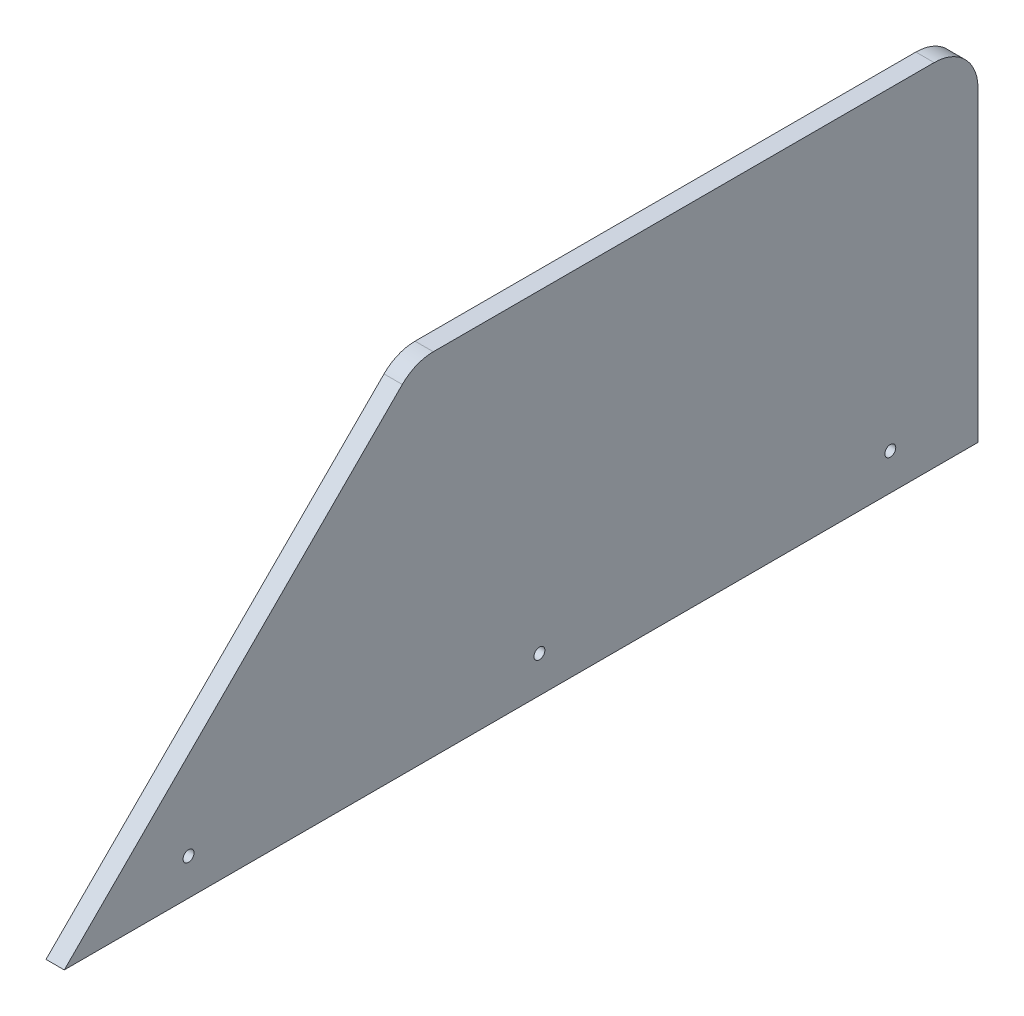
ISO-10303-21;
HEADER;
FILE_DESCRIPTION(('STEP AP214'),'2;1');
FILE_NAME('part.step','',(''),(''),'','','');
FILE_SCHEMA(('AUTOMOTIVE_DESIGN { 1 0 10303 214 1 1 1 1 }'));
ENDSEC;
DATA;
#1=APPLICATION_CONTEXT('core data for automotive mechanical design processes');
#2=APPLICATION_PROTOCOL_DEFINITION('international standard','automotive_design',2000,#1);
#3=PRODUCT_CONTEXT('',#1,'mechanical');
#4=PRODUCT('Part','Part','',(#3));
#5=PRODUCT_RELATED_PRODUCT_CATEGORY('part','',(#4));
#6=PRODUCT_DEFINITION_FORMATION('','',#4);
#7=PRODUCT_DEFINITION_CONTEXT('part definition',#1,'design');
#8=PRODUCT_DEFINITION('design','',#6,#7);
#9=PRODUCT_DEFINITION_SHAPE('','',#8);
#10=(LENGTH_UNIT() NAMED_UNIT(*) SI_UNIT(.MILLI.,.METRE.));
#11=(NAMED_UNIT(*) PLANE_ANGLE_UNIT() SI_UNIT($,.RADIAN.));
#12=(NAMED_UNIT(*) SI_UNIT($,.STERADIAN.) SOLID_ANGLE_UNIT());
#13=UNCERTAINTY_MEASURE_WITH_UNIT(LENGTH_MEASURE(1.E-05),#10,'distance_accuracy_value','');
#14=(GEOMETRIC_REPRESENTATION_CONTEXT(3) GLOBAL_UNCERTAINTY_ASSIGNED_CONTEXT((#13)) GLOBAL_UNIT_ASSIGNED_CONTEXT((#10,
#11,#12)) REPRESENTATION_CONTEXT('',''));
#15=CARTESIAN_POINT('',(0.,0.,0.));
#16=DIRECTION('',(0.,0.,1.));
#17=DIRECTION('',(1.,0.,0.));
#18=AXIS2_PLACEMENT_3D('',#15,#16,#17);
#19=CARTESIAN_POINT('',(5.,0.,0.));
#20=DIRECTION('',(1.,0.,0.));
#21=DIRECTION('',(0.,0.,-1.));
#22=AXIS2_PLACEMENT_3D('',#19,#20,#21);
#23=PLANE('',#22);
#24=CARTESIAN_POINT('',(5.,10.,24.));
#25=DIRECTION('',(1.,0.,0.));
#26=DIRECTION('',(0.,0.,-1.));
#27=AXIS2_PLACEMENT_3D('',#24,#25,#26);
#28=CIRCLE('',#27,1.5);
#29=CARTESIAN_POINT('',(5.,10.,22.5));
#30=VERTEX_POINT('',#29);
#31=EDGE_CURVE('E279',#30,#30,#28,.T.);
#32=ORIENTED_EDGE('',*,*,#31,.F.);
#33=EDGE_LOOP('',(#32));
#34=FACE_BOUND('',#33,.T.);
#35=DIRECTION('',(0.,1.,0.));
#36=VECTOR('',#35,1.);
#37=CARTESIAN_POINT('',(5.,0.,0.));
#38=LINE('',#37,#36);
#39=CARTESIAN_POINT('',(5.,0.,0.));
#40=VERTEX_POINT('',#39);
#41=CARTESIAN_POINT('',(5.,84.,0.));
#42=VERTEX_POINT('',#41);
#43=EDGE_CURVE('E90',#40,#42,#38,.T.);
#44=ORIENTED_EDGE('',*,*,#43,.T.);
#45=CARTESIAN_POINT('',(5.,84.,12.));
#46=DIRECTION('',(1.,0.,0.));
#47=DIRECTION('',(0.,0.,-1.));
#48=AXIS2_PLACEMENT_3D('',#45,#46,#47);
#49=CIRCLE('',#48,12.);
#50=CARTESIAN_POINT('',(5.,96.,12.));
#51=VERTEX_POINT('',#50);
#52=EDGE_CURVE('E45',#42,#51,#49,.T.);
#53=ORIENTED_EDGE('',*,*,#52,.T.);
#54=DIRECTION('',(0.,0.,1.));
#55=VECTOR('',#54,1.);
#56=CARTESIAN_POINT('',(5.,96.,0.));
#57=LINE('',#56,#55);
#58=CARTESIAN_POINT('',(5.,96.,149.029437251522));
#59=VERTEX_POINT('',#58);
#60=EDGE_CURVE('E97',#51,#59,#57,.T.);
#61=ORIENTED_EDGE('',*,*,#60,.T.);
#62=CARTESIAN_POINT('',(5.,84.,149.029437251522));
#63=DIRECTION('',(1.,0.,0.));
#64=DIRECTION('',(0.,0.,-1.));
#65=AXIS2_PLACEMENT_3D('',#62,#63,#64);
#66=CIRCLE('',#65,12.);
#67=CARTESIAN_POINT('',(5.,92.4852813742386,157.51471862576));
#68=VERTEX_POINT('',#67);
#69=EDGE_CURVE('E52',#59,#68,#66,.T.);
#70=ORIENTED_EDGE('',*,*,#69,.T.);
#71=DIRECTION('',(0.,-0.707106781186544,0.707106781186551));
#72=VECTOR('',#71,1.);
#73=CARTESIAN_POINT('',(5.,96.,153.999999999999));
#74=LINE('',#73,#72);
#75=CARTESIAN_POINT('',(5.,0.,250.));
#76=VERTEX_POINT('',#75);
#77=EDGE_CURVE('E102',#68,#76,#74,.T.);
#78=ORIENTED_EDGE('',*,*,#77,.T.);
#79=DIRECTION('',(0.,0.,-1.));
#80=VECTOR('',#79,1.);
#81=CARTESIAN_POINT('',(5.,0.,250.));
#82=LINE('',#81,#80);
#83=EDGE_CURVE('E98',#76,#40,#82,.T.);
#84=ORIENTED_EDGE('',*,*,#83,.T.);
#85=EDGE_LOOP('',(#44,#53,#61,#70,#78,#84));
#86=FACE_BOUND('',#85,.T.);
#87=CARTESIAN_POINT('',(5.,9.99999999999998,120.));
#88=DIRECTION('',(1.,0.,0.));
#89=DIRECTION('',(0.,0.,-1.));
#90=AXIS2_PLACEMENT_3D('',#87,#88,#89);
#91=CIRCLE('',#90,1.5);
#92=CARTESIAN_POINT('',(5.,9.99999999999998,118.5));
#93=VERTEX_POINT('',#92);
#94=EDGE_CURVE('E143',#93,#93,#91,.T.);
#95=ORIENTED_EDGE('',*,*,#94,.F.);
#96=EDGE_LOOP('',(#95));
#97=FACE_BOUND('',#96,.T.);
#98=CARTESIAN_POINT('',(5.,9.99999999999997,216.));
#99=DIRECTION('',(1.,0.,0.));
#100=DIRECTION('',(0.,0.,-1.));
#101=AXIS2_PLACEMENT_3D('',#98,#99,#100);
#102=CIRCLE('',#101,1.5);
#103=CARTESIAN_POINT('',(5.,9.99999999999997,214.5));
#104=VERTEX_POINT('',#103);
#105=EDGE_CURVE('E270',#104,#104,#102,.T.);
#106=ORIENTED_EDGE('',*,*,#105,.F.);
#107=EDGE_LOOP('',(#106));
#108=FACE_BOUND('',#107,.T.);
#109=ADVANCED_FACE('F37',(#34,#86,#97,#108),#23,.T.);
#110=CARTESIAN_POINT('',(0.,0.,0.));
#111=DIRECTION('',(1.,0.,0.));
#112=DIRECTION('',(0.,0.,-1.));
#113=AXIS2_PLACEMENT_3D('',#110,#111,#112);
#114=PLANE('',#113);
#115=DIRECTION('',(0.,0.,1.));
#116=VECTOR('',#115,1.);
#117=CARTESIAN_POINT('',(0.,96.,0.));
#118=LINE('',#117,#116);
#119=CARTESIAN_POINT('',(0.,96.,12.));
#120=VERTEX_POINT('',#119);
#121=CARTESIAN_POINT('',(0.,96.,149.029437251522));
#122=VERTEX_POINT('',#121);
#123=EDGE_CURVE('E140',#120,#122,#118,.T.);
#124=ORIENTED_EDGE('',*,*,#123,.F.);
#125=CARTESIAN_POINT('',(0.,84.,12.));
#126=DIRECTION('',(1.,0.,0.));
#127=DIRECTION('',(0.,0.,-1.));
#128=AXIS2_PLACEMENT_3D('',#125,#126,#127);
#129=CIRCLE('',#128,12.);
#130=CARTESIAN_POINT('',(0.,84.,0.));
#131=VERTEX_POINT('',#130);
#132=EDGE_CURVE('E123',#120,#131,#129,.F.);
#133=ORIENTED_EDGE('',*,*,#132,.T.);
#134=DIRECTION('',(0.,1.,0.));
#135=VECTOR('',#134,1.);
#136=CARTESIAN_POINT('',(0.,0.,0.));
#137=LINE('',#136,#135);
#138=CARTESIAN_POINT('',(0.,0.,0.));
#139=VERTEX_POINT('',#138);
#140=EDGE_CURVE('E139',#139,#131,#137,.T.);
#141=ORIENTED_EDGE('',*,*,#140,.F.);
#142=DIRECTION('',(0.,0.,-1.));
#143=VECTOR('',#142,1.);
#144=CARTESIAN_POINT('',(0.,0.,250.));
#145=LINE('',#144,#143);
#146=CARTESIAN_POINT('',(0.,0.,250.));
#147=VERTEX_POINT('',#146);
#148=EDGE_CURVE('E110',#147,#139,#145,.T.);
#149=ORIENTED_EDGE('',*,*,#148,.F.);
#150=DIRECTION('',(0.,-0.707106781186544,0.707106781186551));
#151=VECTOR('',#150,1.);
#152=CARTESIAN_POINT('',(0.,96.,153.999999999999));
#153=LINE('',#152,#151);
#154=CARTESIAN_POINT('',(0.,92.4852813742386,157.51471862576));
#155=VERTEX_POINT('',#154);
#156=EDGE_CURVE('E106',#155,#147,#153,.T.);
#157=ORIENTED_EDGE('',*,*,#156,.F.);
#158=CARTESIAN_POINT('',(0.,84.,149.029437251522));
#159=DIRECTION('',(1.,0.,0.));
#160=DIRECTION('',(0.,0.,-1.));
#161=AXIS2_PLACEMENT_3D('',#158,#159,#160);
#162=CIRCLE('',#161,12.);
#163=EDGE_CURVE('E121',#155,#122,#162,.F.);
#164=ORIENTED_EDGE('',*,*,#163,.T.);
#165=EDGE_LOOP('',(#124,#133,#141,#149,#157,#164));
#166=FACE_BOUND('',#165,.T.);
#167=CARTESIAN_POINT('',(0.,9.99999999999998,120.));
#168=DIRECTION('',(1.,0.,0.));
#169=DIRECTION('',(0.,0.,-1.));
#170=AXIS2_PLACEMENT_3D('',#167,#168,#169);
#171=CIRCLE('',#170,1.5);
#172=CARTESIAN_POINT('',(0.,9.99999999999998,118.5));
#173=VERTEX_POINT('',#172);
#174=EDGE_CURVE('E282',#173,#173,#171,.T.);
#175=ORIENTED_EDGE('',*,*,#174,.T.);
#176=EDGE_LOOP('',(#175));
#177=FACE_BOUND('',#176,.T.);
#178=CARTESIAN_POINT('',(0.,10.,24.));
#179=DIRECTION('',(1.,0.,0.));
#180=DIRECTION('',(0.,0.,-1.));
#181=AXIS2_PLACEMENT_3D('',#178,#179,#180);
#182=CIRCLE('',#181,1.5);
#183=CARTESIAN_POINT('',(0.,10.,22.5));
#184=VERTEX_POINT('',#183);
#185=EDGE_CURVE('E276',#184,#184,#182,.T.);
#186=ORIENTED_EDGE('',*,*,#185,.T.);
#187=EDGE_LOOP('',(#186));
#188=FACE_BOUND('',#187,.T.);
#189=CARTESIAN_POINT('',(0.,9.99999999999997,216.));
#190=DIRECTION('',(1.,0.,0.));
#191=DIRECTION('',(0.,0.,-1.));
#192=AXIS2_PLACEMENT_3D('',#189,#190,#191);
#193=CIRCLE('',#192,1.5);
#194=CARTESIAN_POINT('',(0.,9.99999999999997,214.5));
#195=VERTEX_POINT('',#194);
#196=EDGE_CURVE('E273',#195,#195,#193,.T.);
#197=ORIENTED_EDGE('',*,*,#196,.T.);
#198=EDGE_LOOP('',(#197));
#199=FACE_BOUND('',#198,.T.);
#200=ADVANCED_FACE('F137',(#166,#177,#188,#199),#114,.F.);
#201=CARTESIAN_POINT('',(5.,0.,250.));
#202=DIRECTION('',(0.,1.,0.));
#203=DIRECTION('',(0.,0.,1.));
#204=AXIS2_PLACEMENT_3D('',#201,#202,#203);
#205=PLANE('',#204);
#206=ORIENTED_EDGE('',*,*,#148,.T.);
#207=DIRECTION('',(-1.,0.,0.));
#208=VECTOR('',#207,1.);
#209=CARTESIAN_POINT('',(5.,0.,0.));
#210=LINE('',#209,#208);
#211=EDGE_CURVE('E94',#40,#139,#210,.T.);
#212=ORIENTED_EDGE('',*,*,#211,.F.);
#213=ORIENTED_EDGE('',*,*,#83,.F.);
#214=DIRECTION('',(-1.,0.,0.));
#215=VECTOR('',#214,1.);
#216=CARTESIAN_POINT('',(5.,0.,250.));
#217=LINE('',#216,#215);
#218=EDGE_CURVE('E112',#76,#147,#217,.T.);
#219=ORIENTED_EDGE('',*,*,#218,.T.);
#220=EDGE_LOOP('',(#206,#212,#213,#219));
#221=FACE_BOUND('',#220,.T.);
#222=ADVANCED_FACE('F108',(#221),#205,.F.);
#223=CARTESIAN_POINT('',(5.,0.,0.));
#224=DIRECTION('',(0.,0.,1.));
#225=DIRECTION('',(1.,0.,0.));
#226=AXIS2_PLACEMENT_3D('',#223,#224,#225);
#227=PLANE('',#226);
#228=ORIENTED_EDGE('',*,*,#140,.T.);
#229=DIRECTION('',(-1.,0.,0.));
#230=VECTOR('',#229,1.);
#231=CARTESIAN_POINT('',(5.,84.,0.));
#232=LINE('',#231,#230);
#233=EDGE_CURVE('E60',#131,#42,#232,.F.);
#234=ORIENTED_EDGE('',*,*,#233,.T.);
#235=ORIENTED_EDGE('',*,*,#43,.F.);
#236=ORIENTED_EDGE('',*,*,#211,.T.);
#237=EDGE_LOOP('',(#228,#234,#235,#236));
#238=FACE_BOUND('',#237,.T.);
#239=ADVANCED_FACE('F92',(#238),#227,.F.);
#240=CARTESIAN_POINT('',(5.,96.,0.));
#241=DIRECTION('',(0.,-1.,0.));
#242=DIRECTION('',(0.,0.,-1.));
#243=AXIS2_PLACEMENT_3D('',#240,#241,#242);
#244=PLANE('',#243);
#245=ORIENTED_EDGE('',*,*,#60,.F.);
#246=DIRECTION('',(-1.,0.,0.));
#247=VECTOR('',#246,1.);
#248=CARTESIAN_POINT('',(5.,96.,12.));
#249=LINE('',#248,#247);
#250=EDGE_CURVE('E114',#51,#120,#249,.T.);
#251=ORIENTED_EDGE('',*,*,#250,.T.);
#252=ORIENTED_EDGE('',*,*,#123,.T.);
#253=DIRECTION('',(-1.,0.,0.));
#254=VECTOR('',#253,1.);
#255=CARTESIAN_POINT('',(5.,96.,149.029437251522));
#256=LINE('',#255,#254);
#257=EDGE_CURVE('E111',#122,#59,#256,.F.);
#258=ORIENTED_EDGE('',*,*,#257,.T.);
#259=EDGE_LOOP('',(#245,#251,#252,#258));
#260=FACE_BOUND('',#259,.T.);
#261=ADVANCED_FACE('F130',(#260),#244,.F.);
#262=CARTESIAN_POINT('',(5.,96.,153.999999999999));
#263=DIRECTION('',(0.,-0.707106781186551,-0.707106781186544));
#264=DIRECTION('',(0.,0.707106781186544,-0.707106781186551));
#265=AXIS2_PLACEMENT_3D('',#262,#263,#264);
#266=PLANE('',#265);
#267=ORIENTED_EDGE('',*,*,#77,.F.);
#268=DIRECTION('',(-1.,0.,0.));
#269=VECTOR('',#268,1.);
#270=CARTESIAN_POINT('',(5.,92.4852813742386,157.51471862576));
#271=LINE('',#270,#269);
#272=EDGE_CURVE('E11',#68,#155,#271,.T.);
#273=ORIENTED_EDGE('',*,*,#272,.T.);
#274=ORIENTED_EDGE('',*,*,#156,.T.);
#275=ORIENTED_EDGE('',*,*,#218,.F.);
#276=EDGE_LOOP('',(#267,#273,#274,#275));
#277=FACE_BOUND('',#276,.T.);
#278=ADVANCED_FACE('F148',(#277),#266,.F.);
#279=CARTESIAN_POINT('',(5.,9.99999999999998,120.));
#280=DIRECTION('',(-1.,0.,0.));
#281=DIRECTION('',(0.,0.,1.));
#282=AXIS2_PLACEMENT_3D('',#279,#280,#281);
#283=CYLINDRICAL_SURFACE('',#282,1.5);
#284=ORIENTED_EDGE('',*,*,#94,.T.);
#285=EDGE_LOOP('',(#284));
#286=FACE_BOUND('',#285,.T.);
#287=ORIENTED_EDGE('',*,*,#174,.F.);
#288=EDGE_LOOP('',(#287));
#289=FACE_BOUND('',#288,.T.);
#290=ADVANCED_FACE('F165',(#286,#289),#283,.F.);
#291=CARTESIAN_POINT('',(5.,10.,24.));
#292=DIRECTION('',(-1.,0.,0.));
#293=DIRECTION('',(0.,0.,1.));
#294=AXIS2_PLACEMENT_3D('',#291,#292,#293);
#295=CYLINDRICAL_SURFACE('',#294,1.5);
#296=ORIENTED_EDGE('',*,*,#31,.T.);
#297=EDGE_LOOP('',(#296));
#298=FACE_BOUND('',#297,.T.);
#299=ORIENTED_EDGE('',*,*,#185,.F.);
#300=EDGE_LOOP('',(#299));
#301=FACE_BOUND('',#300,.T.);
#302=ADVANCED_FACE('F198',(#298,#301),#295,.F.);
#303=CARTESIAN_POINT('',(5.,9.99999999999997,216.));
#304=DIRECTION('',(-1.,0.,0.));
#305=DIRECTION('',(0.,0.,1.));
#306=AXIS2_PLACEMENT_3D('',#303,#304,#305);
#307=CYLINDRICAL_SURFACE('',#306,1.5);
#308=ORIENTED_EDGE('',*,*,#105,.T.);
#309=EDGE_LOOP('',(#308));
#310=FACE_BOUND('',#309,.T.);
#311=ORIENTED_EDGE('',*,*,#196,.F.);
#312=EDGE_LOOP('',(#311));
#313=FACE_BOUND('',#312,.T.);
#314=ADVANCED_FACE('F155',(#310,#313),#307,.F.);
#315=CARTESIAN_POINT('',(5.,84.,12.));
#316=DIRECTION('',(-1.,0.,0.));
#317=DIRECTION('',(0.,0.,1.));
#318=AXIS2_PLACEMENT_3D('',#315,#316,#317);
#319=CYLINDRICAL_SURFACE('',#318,12.);
#320=ORIENTED_EDGE('',*,*,#52,.F.);
#321=ORIENTED_EDGE('',*,*,#233,.F.);
#322=ORIENTED_EDGE('',*,*,#132,.F.);
#323=ORIENTED_EDGE('',*,*,#250,.F.);
#324=EDGE_LOOP('',(#320,#321,#322,#323));
#325=FACE_BOUND('',#324,.T.);
#326=ADVANCED_FACE('F135',(#325),#319,.T.);
#327=CARTESIAN_POINT('',(5.,84.,149.029437251522));
#328=DIRECTION('',(-1.,0.,0.));
#329=DIRECTION('',(0.,0.,1.));
#330=AXIS2_PLACEMENT_3D('',#327,#328,#329);
#331=CYLINDRICAL_SURFACE('',#330,12.);
#332=ORIENTED_EDGE('',*,*,#69,.F.);
#333=ORIENTED_EDGE('',*,*,#257,.F.);
#334=ORIENTED_EDGE('',*,*,#163,.F.);
#335=ORIENTED_EDGE('',*,*,#272,.F.);
#336=EDGE_LOOP('',(#332,#333,#334,#335));
#337=FACE_BOUND('',#336,.T.);
#338=ADVANCED_FACE('F39',(#337),#331,.T.);
#339=CLOSED_SHELL('',(#109,#200,#222,#239,#261,#278,#290,#302,#314,#326,#338));
#340=MANIFOLD_SOLID_BREP('B2',#339);
#341=ADVANCED_BREP_SHAPE_REPRESENTATION('',(#18,#340),#14);
#342=SHAPE_DEFINITION_REPRESENTATION(#9,#341);
ENDSEC;
END-ISO-10303-21;
